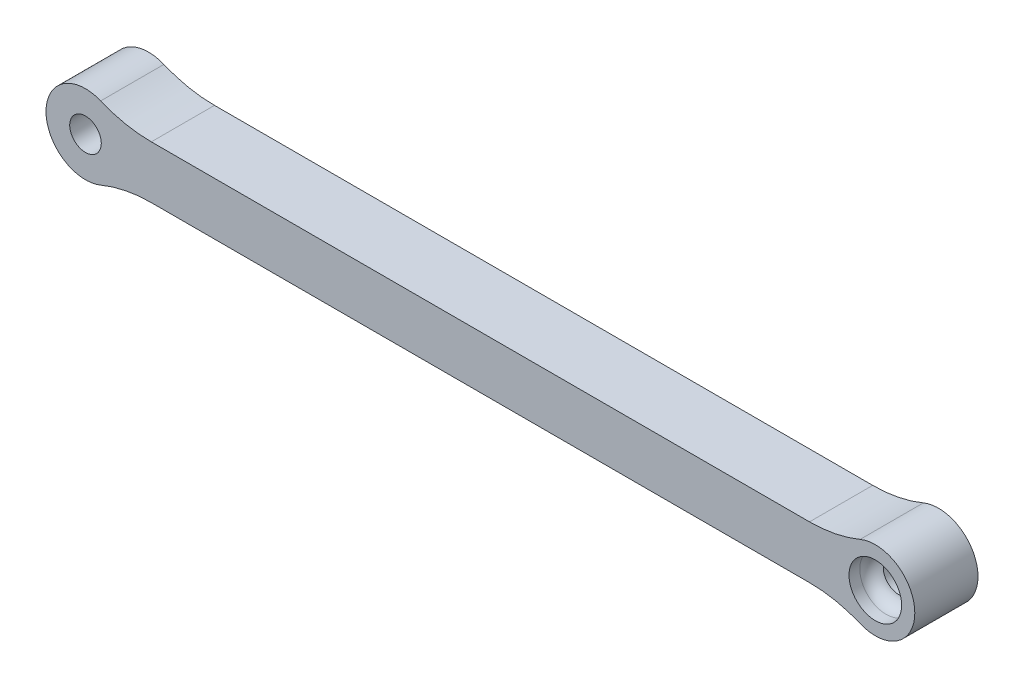
ISO-10303-21;
HEADER;
FILE_DESCRIPTION(('STEP AP214'),'2;1');
FILE_NAME('part.step','',(''),(''),'','','');
FILE_SCHEMA(('AUTOMOTIVE_DESIGN { 1 0 10303 214 1 1 1 1 }'));
ENDSEC;
DATA;
#1=APPLICATION_CONTEXT('core data for automotive mechanical design processes');
#2=APPLICATION_PROTOCOL_DEFINITION('international standard','automotive_design',2000,#1);
#3=PRODUCT_CONTEXT('',#1,'mechanical');
#4=PRODUCT('Part','Part','',(#3));
#5=PRODUCT_RELATED_PRODUCT_CATEGORY('part','',(#4));
#6=PRODUCT_DEFINITION_FORMATION('','',#4);
#7=PRODUCT_DEFINITION_CONTEXT('part definition',#1,'design');
#8=PRODUCT_DEFINITION('design','',#6,#7);
#9=PRODUCT_DEFINITION_SHAPE('','',#8);
#10=(LENGTH_UNIT() NAMED_UNIT(*) SI_UNIT(.MILLI.,.METRE.));
#11=(NAMED_UNIT(*) PLANE_ANGLE_UNIT() SI_UNIT($,.RADIAN.));
#12=(NAMED_UNIT(*) SI_UNIT($,.STERADIAN.) SOLID_ANGLE_UNIT());
#13=UNCERTAINTY_MEASURE_WITH_UNIT(LENGTH_MEASURE(1.E-05),#10,'distance_accuracy_value','');
#14=(GEOMETRIC_REPRESENTATION_CONTEXT(3) GLOBAL_UNCERTAINTY_ASSIGNED_CONTEXT((#13)) GLOBAL_UNIT_ASSIGNED_CONTEXT((#10,
#11,#12)) REPRESENTATION_CONTEXT('',''));
#15=CARTESIAN_POINT('',(0.,0.,0.));
#16=DIRECTION('',(0.,0.,1.));
#17=DIRECTION('',(1.,0.,0.));
#18=AXIS2_PLACEMENT_3D('',#15,#16,#17);
#19=CARTESIAN_POINT('',(60.,0.,4.8));
#20=DIRECTION('',(0.,0.,-1.));
#21=DIRECTION('',(-1.,0.,0.));
#22=AXIS2_PLACEMENT_3D('',#19,#20,#21);
#23=CYLINDRICAL_SURFACE('',#22,1.2);
#24=CARTESIAN_POINT('',(60.,0.,0.));
#25=DIRECTION('',(0.,0.,1.));
#26=DIRECTION('',(1.,0.,0.));
#27=AXIS2_PLACEMENT_3D('',#24,#25,#26);
#28=CIRCLE('',#27,1.2);
#29=CARTESIAN_POINT('',(61.2,0.,0.));
#30=VERTEX_POINT('',#29);
#31=EDGE_CURVE('E168',#30,#30,#28,.T.);
#32=ORIENTED_EDGE('',*,*,#31,.F.);
#33=EDGE_LOOP('',(#32));
#34=FACE_BOUND('',#33,.T.);
#35=CARTESIAN_POINT('',(60.,0.,3.));
#36=DIRECTION('',(0.,0.,1.));
#37=DIRECTION('',(1.,0.,0.));
#38=AXIS2_PLACEMENT_3D('',#35,#36,#37);
#39=CIRCLE('',#38,1.2);
#40=CARTESIAN_POINT('',(61.2,0.,3.));
#41=VERTEX_POINT('',#40);
#42=EDGE_CURVE('E166',#41,#41,#39,.T.);
#43=ORIENTED_EDGE('',*,*,#42,.T.);
#44=EDGE_LOOP('',(#43));
#45=FACE_BOUND('',#44,.T.);
#46=ADVANCED_FACE('F39',(#34,#45),#23,.F.);
#47=CARTESIAN_POINT('',(5.,12.,4.8));
#48=DIRECTION('',(0.,0.,-1.));
#49=DIRECTION('',(-1.,0.,0.));
#50=AXIS2_PLACEMENT_3D('',#47,#48,#49);
#51=PLANE('',#50);
#52=CARTESIAN_POINT('',(60.,0.,4.8));
#53=DIRECTION('',(0.,0.,1.));
#54=DIRECTION('',(1.,0.,0.));
#55=AXIS2_PLACEMENT_3D('',#52,#53,#54);
#56=CIRCLE('',#55,2.);
#57=CARTESIAN_POINT('',(62.,0.,4.8));
#58=VERTEX_POINT('',#57);
#59=EDGE_CURVE('E169',#58,#58,#56,.T.);
#60=ORIENTED_EDGE('',*,*,#59,.F.);
#61=EDGE_LOOP('',(#60));
#62=FACE_BOUND('',#61,.T.);
#63=CARTESIAN_POINT('',(5.,12.,4.8));
#64=DIRECTION('',(0.,0.,-1.));
#65=DIRECTION('',(-1.,0.,0.));
#66=AXIS2_PLACEMENT_3D('',#63,#64,#65);
#67=CIRCLE('',#66,10.);
#68=CARTESIAN_POINT('',(5.,2.,4.8));
#69=VERTEX_POINT('',#68);
#70=CARTESIAN_POINT('',(1.15384615384616,2.76923076923077,4.8));
#71=VERTEX_POINT('',#70);
#72=EDGE_CURVE('E153',#69,#71,#67,.T.);
#73=ORIENTED_EDGE('',*,*,#72,.T.);
#74=CARTESIAN_POINT('',(0.,0.,4.8));
#75=DIRECTION('',(0.,0.,1.));
#76=DIRECTION('',(1.,0.,0.));
#77=AXIS2_PLACEMENT_3D('',#74,#75,#76);
#78=CIRCLE('',#77,3.);
#79=CARTESIAN_POINT('',(1.15384615384616,-2.76923076923077,4.8));
#80=VERTEX_POINT('',#79);
#81=EDGE_CURVE('E100',#71,#80,#78,.T.);
#82=ORIENTED_EDGE('',*,*,#81,.T.);
#83=CARTESIAN_POINT('',(5.,-12.,4.8));
#84=DIRECTION('',(0.,0.,-1.));
#85=DIRECTION('',(1.,0.,0.));
#86=AXIS2_PLACEMENT_3D('',#83,#84,#85);
#87=CIRCLE('',#86,10.);
#88=CARTESIAN_POINT('',(5.,-2.,4.8));
#89=VERTEX_POINT('',#88);
#90=EDGE_CURVE('E186',#80,#89,#87,.T.);
#91=ORIENTED_EDGE('',*,*,#90,.T.);
#92=DIRECTION('',(1.,0.,0.));
#93=VECTOR('',#92,1.);
#94=CARTESIAN_POINT('',(5.,-2.,4.8));
#95=LINE('',#94,#93);
#96=CARTESIAN_POINT('',(55.,-2.,4.8));
#97=VERTEX_POINT('',#96);
#98=EDGE_CURVE('E188',#89,#97,#95,.T.);
#99=ORIENTED_EDGE('',*,*,#98,.T.);
#100=CARTESIAN_POINT('',(55.,-12.,4.8));
#101=DIRECTION('',(0.,0.,-1.));
#102=DIRECTION('',(-1.,0.,0.));
#103=AXIS2_PLACEMENT_3D('',#100,#101,#102);
#104=CIRCLE('',#103,10.);
#105=CARTESIAN_POINT('',(58.8461538461538,-2.76923076923077,4.8));
#106=VERTEX_POINT('',#105);
#107=EDGE_CURVE('E120',#97,#106,#104,.T.);
#108=ORIENTED_EDGE('',*,*,#107,.T.);
#109=CARTESIAN_POINT('',(60.,0.,4.8));
#110=DIRECTION('',(0.,0.,1.));
#111=DIRECTION('',(1.,0.,0.));
#112=AXIS2_PLACEMENT_3D('',#109,#110,#111);
#113=CIRCLE('',#112,3.00000000000001);
#114=CARTESIAN_POINT('',(58.8461538461538,2.76923076923077,4.8));
#115=VERTEX_POINT('',#114);
#116=EDGE_CURVE('E113',#106,#115,#113,.T.);
#117=ORIENTED_EDGE('',*,*,#116,.T.);
#118=CARTESIAN_POINT('',(55.,12.,4.8));
#119=DIRECTION('',(0.,0.,-1.));
#120=DIRECTION('',(1.,0.,0.));
#121=AXIS2_PLACEMENT_3D('',#118,#119,#120);
#122=CIRCLE('',#121,10.);
#123=CARTESIAN_POINT('',(55.,2.,4.8));
#124=VERTEX_POINT('',#123);
#125=EDGE_CURVE('E118',#115,#124,#122,.T.);
#126=ORIENTED_EDGE('',*,*,#125,.T.);
#127=DIRECTION('',(-1.,0.,0.));
#128=VECTOR('',#127,1.);
#129=CARTESIAN_POINT('',(5.,2.,4.8));
#130=LINE('',#129,#128);
#131=EDGE_CURVE('E56',#124,#69,#130,.T.);
#132=ORIENTED_EDGE('',*,*,#131,.T.);
#133=EDGE_LOOP('',(#73,#82,#91,#99,#108,#117,#126,#132));
#134=FACE_BOUND('',#133,.T.);
#135=CARTESIAN_POINT('',(0.,0.,4.8));
#136=DIRECTION('',(0.,0.,1.));
#137=DIRECTION('',(1.,0.,0.));
#138=AXIS2_PLACEMENT_3D('',#135,#136,#137);
#139=CIRCLE('',#138,1.2);
#140=CARTESIAN_POINT('',(1.2,0.,4.8));
#141=VERTEX_POINT('',#140);
#142=EDGE_CURVE('E142',#141,#141,#139,.T.);
#143=ORIENTED_EDGE('',*,*,#142,.F.);
#144=EDGE_LOOP('',(#143));
#145=FACE_BOUND('',#144,.T.);
#146=ADVANCED_FACE('F115',(#62,#134,#145),#51,.F.);
#147=CARTESIAN_POINT('',(5.,12.,0.));
#148=DIRECTION('',(0.,0.,-1.));
#149=DIRECTION('',(-1.,0.,0.));
#150=AXIS2_PLACEMENT_3D('',#147,#148,#149);
#151=PLANE('',#150);
#152=CARTESIAN_POINT('',(0.,0.,0.));
#153=DIRECTION('',(0.,0.,1.));
#154=DIRECTION('',(1.,0.,0.));
#155=AXIS2_PLACEMENT_3D('',#152,#153,#154);
#156=CIRCLE('',#155,1.2);
#157=CARTESIAN_POINT('',(1.2,0.,0.));
#158=VERTEX_POINT('',#157);
#159=EDGE_CURVE('E173',#158,#158,#156,.T.);
#160=ORIENTED_EDGE('',*,*,#159,.T.);
#161=EDGE_LOOP('',(#160));
#162=FACE_BOUND('',#161,.T.);
#163=CARTESIAN_POINT('',(5.,12.,0.));
#164=DIRECTION('',(0.,0.,-1.));
#165=DIRECTION('',(-1.,0.,0.));
#166=AXIS2_PLACEMENT_3D('',#163,#164,#165);
#167=CIRCLE('',#166,10.);
#168=CARTESIAN_POINT('',(5.,2.,0.));
#169=VERTEX_POINT('',#168);
#170=CARTESIAN_POINT('',(1.15384615384616,2.76923076923077,0.));
#171=VERTEX_POINT('',#170);
#172=EDGE_CURVE('E138',#169,#171,#167,.T.);
#173=ORIENTED_EDGE('',*,*,#172,.F.);
#174=DIRECTION('',(-1.,0.,0.));
#175=VECTOR('',#174,1.);
#176=CARTESIAN_POINT('',(5.,2.,0.));
#177=LINE('',#176,#175);
#178=CARTESIAN_POINT('',(55.,2.,0.));
#179=VERTEX_POINT('',#178);
#180=EDGE_CURVE('E91',#179,#169,#177,.T.);
#181=ORIENTED_EDGE('',*,*,#180,.F.);
#182=CARTESIAN_POINT('',(55.,12.,0.));
#183=DIRECTION('',(0.,0.,-1.));
#184=DIRECTION('',(1.,0.,0.));
#185=AXIS2_PLACEMENT_3D('',#182,#183,#184);
#186=CIRCLE('',#185,10.);
#187=CARTESIAN_POINT('',(58.8461538461538,2.76923076923077,0.));
#188=VERTEX_POINT('',#187);
#189=EDGE_CURVE('E85',#188,#179,#186,.T.);
#190=ORIENTED_EDGE('',*,*,#189,.F.);
#191=CARTESIAN_POINT('',(60.,0.,0.));
#192=DIRECTION('',(0.,0.,1.));
#193=DIRECTION('',(1.,0.,0.));
#194=AXIS2_PLACEMENT_3D('',#191,#192,#193);
#195=CIRCLE('',#194,3.00000000000001);
#196=CARTESIAN_POINT('',(58.8461538461538,-2.76923076923077,0.));
#197=VERTEX_POINT('',#196);
#198=EDGE_CURVE('E128',#197,#188,#195,.T.);
#199=ORIENTED_EDGE('',*,*,#198,.F.);
#200=CARTESIAN_POINT('',(55.,-12.,0.));
#201=DIRECTION('',(0.,0.,-1.));
#202=DIRECTION('',(-1.,0.,0.));
#203=AXIS2_PLACEMENT_3D('',#200,#201,#202);
#204=CIRCLE('',#203,10.);
#205=CARTESIAN_POINT('',(55.,-2.,0.));
#206=VERTEX_POINT('',#205);
#207=EDGE_CURVE('E148',#206,#197,#204,.T.);
#208=ORIENTED_EDGE('',*,*,#207,.F.);
#209=DIRECTION('',(1.,0.,0.));
#210=VECTOR('',#209,1.);
#211=CARTESIAN_POINT('',(5.,-2.,0.));
#212=LINE('',#211,#210);
#213=CARTESIAN_POINT('',(5.,-2.,0.));
#214=VERTEX_POINT('',#213);
#215=EDGE_CURVE('E146',#214,#206,#212,.T.);
#216=ORIENTED_EDGE('',*,*,#215,.F.);
#217=CARTESIAN_POINT('',(5.,-12.,0.));
#218=DIRECTION('',(0.,0.,-1.));
#219=DIRECTION('',(1.,0.,0.));
#220=AXIS2_PLACEMENT_3D('',#217,#218,#219);
#221=CIRCLE('',#220,10.);
#222=CARTESIAN_POINT('',(1.15384615384616,-2.76923076923077,0.));
#223=VERTEX_POINT('',#222);
#224=EDGE_CURVE('E144',#223,#214,#221,.T.);
#225=ORIENTED_EDGE('',*,*,#224,.F.);
#226=CARTESIAN_POINT('',(0.,0.,0.));
#227=DIRECTION('',(0.,0.,1.));
#228=DIRECTION('',(1.,0.,0.));
#229=AXIS2_PLACEMENT_3D('',#226,#227,#228);
#230=CIRCLE('',#229,3.);
#231=EDGE_CURVE('E141',#171,#223,#230,.T.);
#232=ORIENTED_EDGE('',*,*,#231,.F.);
#233=EDGE_LOOP('',(#173,#181,#190,#199,#208,#216,#225,#232));
#234=FACE_BOUND('',#233,.T.);
#235=ORIENTED_EDGE('',*,*,#31,.T.);
#236=EDGE_LOOP('',(#235));
#237=FACE_BOUND('',#236,.T.);
#238=ADVANCED_FACE('F201',(#162,#234,#237),#151,.T.);
#239=CARTESIAN_POINT('',(5.,12.,4.8));
#240=DIRECTION('',(0.,0.,-1.));
#241=DIRECTION('',(-1.,0.,0.));
#242=AXIS2_PLACEMENT_3D('',#239,#240,#241);
#243=CYLINDRICAL_SURFACE('',#242,10.);
#244=ORIENTED_EDGE('',*,*,#172,.T.);
#245=DIRECTION('',(0.,0.,-1.));
#246=VECTOR('',#245,1.);
#247=CARTESIAN_POINT('',(1.15384615384616,2.76923076923077,4.8));
#248=LINE('',#247,#246);
#249=EDGE_CURVE('E48',#71,#171,#248,.T.);
#250=ORIENTED_EDGE('',*,*,#249,.F.);
#251=ORIENTED_EDGE('',*,*,#72,.F.);
#252=DIRECTION('',(0.,0.,-1.));
#253=VECTOR('',#252,1.);
#254=CARTESIAN_POINT('',(5.,2.,4.8));
#255=LINE('',#254,#253);
#256=EDGE_CURVE('E134',#69,#169,#255,.T.);
#257=ORIENTED_EDGE('',*,*,#256,.T.);
#258=EDGE_LOOP('',(#244,#250,#251,#257));
#259=FACE_BOUND('',#258,.T.);
#260=ADVANCED_FACE('F206',(#259),#243,.F.);
#261=CARTESIAN_POINT('',(0.,0.,4.8));
#262=DIRECTION('',(0.,0.,-1.));
#263=DIRECTION('',(-1.,0.,0.));
#264=AXIS2_PLACEMENT_3D('',#261,#262,#263);
#265=CYLINDRICAL_SURFACE('',#264,3.);
#266=ORIENTED_EDGE('',*,*,#231,.T.);
#267=DIRECTION('',(0.,0.,-1.));
#268=VECTOR('',#267,1.);
#269=CARTESIAN_POINT('',(1.15384615384616,-2.76923076923077,4.8));
#270=LINE('',#269,#268);
#271=EDGE_CURVE('E163',#80,#223,#270,.T.);
#272=ORIENTED_EDGE('',*,*,#271,.F.);
#273=ORIENTED_EDGE('',*,*,#81,.F.);
#274=ORIENTED_EDGE('',*,*,#249,.T.);
#275=EDGE_LOOP('',(#266,#272,#273,#274));
#276=FACE_BOUND('',#275,.T.);
#277=ADVANCED_FACE('F236',(#276),#265,.T.);
#278=CARTESIAN_POINT('',(5.,-12.,4.8));
#279=DIRECTION('',(0.,0.,-1.));
#280=DIRECTION('',(-1.,0.,0.));
#281=AXIS2_PLACEMENT_3D('',#278,#279,#280);
#282=CYLINDRICAL_SURFACE('',#281,10.);
#283=ORIENTED_EDGE('',*,*,#224,.T.);
#284=DIRECTION('',(0.,0.,-1.));
#285=VECTOR('',#284,1.);
#286=CARTESIAN_POINT('',(5.,-2.,4.8));
#287=LINE('',#286,#285);
#288=EDGE_CURVE('E160',#89,#214,#287,.T.);
#289=ORIENTED_EDGE('',*,*,#288,.F.);
#290=ORIENTED_EDGE('',*,*,#90,.F.);
#291=ORIENTED_EDGE('',*,*,#271,.T.);
#292=EDGE_LOOP('',(#283,#289,#290,#291));
#293=FACE_BOUND('',#292,.T.);
#294=ADVANCED_FACE('F242',(#293),#282,.F.);
#295=CARTESIAN_POINT('',(5.,-2.,4.8));
#296=DIRECTION('',(0.,1.,0.));
#297=DIRECTION('',(0.,0.,1.));
#298=AXIS2_PLACEMENT_3D('',#295,#296,#297);
#299=PLANE('',#298);
#300=ORIENTED_EDGE('',*,*,#215,.T.);
#301=DIRECTION('',(0.,0.,-1.));
#302=VECTOR('',#301,1.);
#303=CARTESIAN_POINT('',(55.,-2.,4.8));
#304=LINE('',#303,#302);
#305=EDGE_CURVE('E157',#97,#206,#304,.T.);
#306=ORIENTED_EDGE('',*,*,#305,.F.);
#307=ORIENTED_EDGE('',*,*,#98,.F.);
#308=ORIENTED_EDGE('',*,*,#288,.T.);
#309=EDGE_LOOP('',(#300,#306,#307,#308));
#310=FACE_BOUND('',#309,.T.);
#311=ADVANCED_FACE('F194',(#310),#299,.F.);
#312=CARTESIAN_POINT('',(55.,-12.,4.8));
#313=DIRECTION('',(0.,0.,-1.));
#314=DIRECTION('',(-1.,0.,0.));
#315=AXIS2_PLACEMENT_3D('',#312,#313,#314);
#316=CYLINDRICAL_SURFACE('',#315,10.);
#317=ORIENTED_EDGE('',*,*,#207,.T.);
#318=DIRECTION('',(0.,0.,-1.));
#319=VECTOR('',#318,1.);
#320=CARTESIAN_POINT('',(58.8461538461538,-2.76923076923077,4.8));
#321=LINE('',#320,#319);
#322=EDGE_CURVE('E129',#106,#197,#321,.T.);
#323=ORIENTED_EDGE('',*,*,#322,.F.);
#324=ORIENTED_EDGE('',*,*,#107,.F.);
#325=ORIENTED_EDGE('',*,*,#305,.T.);
#326=EDGE_LOOP('',(#317,#323,#324,#325));
#327=FACE_BOUND('',#326,.T.);
#328=ADVANCED_FACE('F198',(#327),#316,.F.);
#329=CARTESIAN_POINT('',(60.,0.,4.8));
#330=DIRECTION('',(0.,0.,-1.));
#331=DIRECTION('',(-1.,0.,0.));
#332=AXIS2_PLACEMENT_3D('',#329,#330,#331);
#333=CYLINDRICAL_SURFACE('',#332,3.00000000000001);
#334=ORIENTED_EDGE('',*,*,#198,.T.);
#335=DIRECTION('',(0.,0.,-1.));
#336=VECTOR('',#335,1.);
#337=CARTESIAN_POINT('',(58.8461538461538,2.76923076923077,4.8));
#338=LINE('',#337,#336);
#339=EDGE_CURVE('E125',#115,#188,#338,.T.);
#340=ORIENTED_EDGE('',*,*,#339,.F.);
#341=ORIENTED_EDGE('',*,*,#116,.F.);
#342=ORIENTED_EDGE('',*,*,#322,.T.);
#343=EDGE_LOOP('',(#334,#340,#341,#342));
#344=FACE_BOUND('',#343,.T.);
#345=ADVANCED_FACE('F126',(#344),#333,.T.);
#346=CARTESIAN_POINT('',(55.,12.,4.8));
#347=DIRECTION('',(0.,0.,-1.));
#348=DIRECTION('',(-1.,0.,0.));
#349=AXIS2_PLACEMENT_3D('',#346,#347,#348);
#350=CYLINDRICAL_SURFACE('',#349,10.);
#351=ORIENTED_EDGE('',*,*,#189,.T.);
#352=DIRECTION('',(0.,0.,-1.));
#353=VECTOR('',#352,1.);
#354=CARTESIAN_POINT('',(55.,2.,4.8));
#355=LINE('',#354,#353);
#356=EDGE_CURVE('E130',#124,#179,#355,.T.);
#357=ORIENTED_EDGE('',*,*,#356,.F.);
#358=ORIENTED_EDGE('',*,*,#125,.F.);
#359=ORIENTED_EDGE('',*,*,#339,.T.);
#360=EDGE_LOOP('',(#351,#357,#358,#359));
#361=FACE_BOUND('',#360,.T.);
#362=ADVANCED_FACE('F132',(#361),#350,.F.);
#363=CARTESIAN_POINT('',(5.,2.,4.8));
#364=DIRECTION('',(0.,-1.,0.));
#365=DIRECTION('',(0.,0.,-1.));
#366=AXIS2_PLACEMENT_3D('',#363,#364,#365);
#367=PLANE('',#366);
#368=ORIENTED_EDGE('',*,*,#180,.T.);
#369=ORIENTED_EDGE('',*,*,#256,.F.);
#370=ORIENTED_EDGE('',*,*,#131,.F.);
#371=ORIENTED_EDGE('',*,*,#356,.T.);
#372=EDGE_LOOP('',(#368,#369,#370,#371));
#373=FACE_BOUND('',#372,.T.);
#374=ADVANCED_FACE('F208',(#373),#367,.F.);
#375=CARTESIAN_POINT('',(0.,0.,4.8));
#376=DIRECTION('',(0.,0.,-1.));
#377=DIRECTION('',(-1.,0.,0.));
#378=AXIS2_PLACEMENT_3D('',#375,#376,#377);
#379=CYLINDRICAL_SURFACE('',#378,1.2);
#380=ORIENTED_EDGE('',*,*,#142,.T.);
#381=EDGE_LOOP('',(#380));
#382=FACE_BOUND('',#381,.T.);
#383=ORIENTED_EDGE('',*,*,#159,.F.);
#384=EDGE_LOOP('',(#383));
#385=FACE_BOUND('',#384,.T.);
#386=ADVANCED_FACE('F210',(#382,#385),#379,.F.);
#387=CARTESIAN_POINT('',(60.,0.,3.));
#388=DIRECTION('',(0.,0.,1.));
#389=DIRECTION('',(1.,0.,0.));
#390=AXIS2_PLACEMENT_3D('',#387,#388,#389);
#391=CYLINDRICAL_SURFACE('',#390,2.);
#392=CARTESIAN_POINT('',(60.,0.,3.97979589711327));
#393=DIRECTION('',(0.,0.,-1.));
#394=DIRECTION('',(-1.,0.,0.));
#395=AXIS2_PLACEMENT_3D('',#392,#393,#394);
#396=CIRCLE('',#395,2.);
#397=CARTESIAN_POINT('',(58.,0.,3.97979589711327));
#398=VERTEX_POINT('',#397);
#399=EDGE_CURVE('E11',#398,#398,#396,.T.);
#400=ORIENTED_EDGE('',*,*,#399,.T.);
#401=EDGE_LOOP('',(#400));
#402=FACE_BOUND('',#401,.T.);
#403=ORIENTED_EDGE('',*,*,#59,.T.);
#404=EDGE_LOOP('',(#403));
#405=FACE_BOUND('',#404,.T.);
#406=ADVANCED_FACE('F216',(#402,#405),#391,.F.);
#407=CARTESIAN_POINT('',(60.,0.,3.97979589711327));
#408=DIRECTION('',(0.,0.,-1.));
#409=DIRECTION('',(-1.,0.,0.));
#410=AXIS2_PLACEMENT_3D('',#407,#408,#409);
#411=TOROIDAL_SURFACE('',#410,1.,1.);
#412=ORIENTED_EDGE('',*,*,#399,.F.);
#413=EDGE_LOOP('',(#412));
#414=FACE_BOUND('',#413,.T.);
#415=ORIENTED_EDGE('',*,*,#42,.F.);
#416=EDGE_LOOP('',(#415));
#417=FACE_BOUND('',#416,.T.);
#418=ADVANCED_FACE('F41',(#414,#417),#411,.F.);
#419=CLOSED_SHELL('',(#46,#146,#238,#260,#277,#294,#311,#328,#345,#362,#374,#386,#406,#418));
#420=MANIFOLD_SOLID_BREP('B2',#419);
#421=ADVANCED_BREP_SHAPE_REPRESENTATION('',(#18,#420),#14);
#422=SHAPE_DEFINITION_REPRESENTATION(#9,#421);
ENDSEC;
END-ISO-10303-21;
